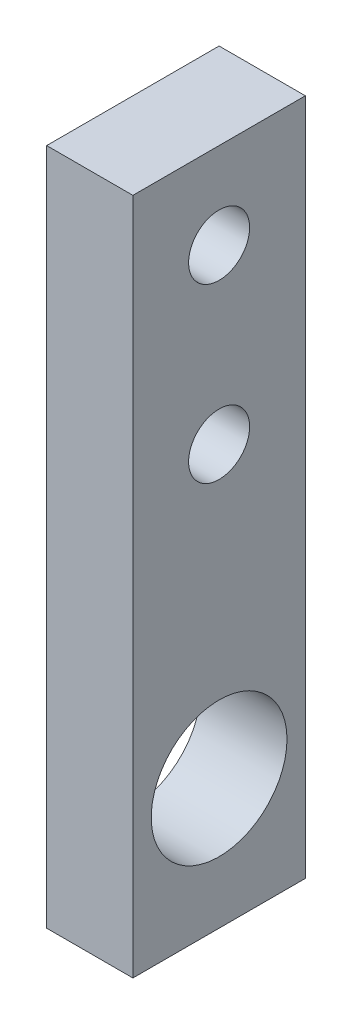
ISO-10303-21;
HEADER;
FILE_DESCRIPTION(('STEP AP214'),'2;1');
FILE_NAME('part.step','',(''),(''),'','','');
FILE_SCHEMA(('AUTOMOTIVE_DESIGN { 1 0 10303 214 1 1 1 1 }'));
ENDSEC;
DATA;
#1=APPLICATION_CONTEXT('core data for automotive mechanical design processes');
#2=APPLICATION_PROTOCOL_DEFINITION('international standard','automotive_design',2000,#1);
#3=PRODUCT_CONTEXT('',#1,'mechanical');
#4=PRODUCT('Part','Part','',(#3));
#5=PRODUCT_RELATED_PRODUCT_CATEGORY('part','',(#4));
#6=PRODUCT_DEFINITION_FORMATION('','',#4);
#7=PRODUCT_DEFINITION_CONTEXT('part definition',#1,'design');
#8=PRODUCT_DEFINITION('design','',#6,#7);
#9=PRODUCT_DEFINITION_SHAPE('','',#8);
#10=(LENGTH_UNIT() NAMED_UNIT(*) SI_UNIT(.MILLI.,.METRE.));
#11=(NAMED_UNIT(*) PLANE_ANGLE_UNIT() SI_UNIT($,.RADIAN.));
#12=(NAMED_UNIT(*) SI_UNIT($,.STERADIAN.) SOLID_ANGLE_UNIT());
#13=UNCERTAINTY_MEASURE_WITH_UNIT(LENGTH_MEASURE(1.E-05),#10,'distance_accuracy_value','');
#14=(GEOMETRIC_REPRESENTATION_CONTEXT(3) GLOBAL_UNCERTAINTY_ASSIGNED_CONTEXT((#13)) GLOBAL_UNIT_ASSIGNED_CONTEXT((#10,
#11,#12)) REPRESENTATION_CONTEXT('',''));
#15=CARTESIAN_POINT('',(0.,0.,0.));
#16=DIRECTION('',(0.,0.,1.));
#17=DIRECTION('',(1.,0.,0.));
#18=AXIS2_PLACEMENT_3D('',#15,#16,#17);
#19=CARTESIAN_POINT('',(40.64,-24.530132824,10.475));
#20=DIRECTION('',(-1.,0.,0.));
#21=DIRECTION('',(0.,0.,1.));
#22=AXIS2_PLACEMENT_3D('',#19,#20,#21);
#23=PLANE('',#22);
#24=CARTESIAN_POINT('',(40.64,6.35,16.825));
#25=DIRECTION('',(-1.,0.,0.));
#26=DIRECTION('',(0.,0.,1.));
#27=AXIS2_PLACEMENT_3D('',#24,#25,#26);
#28=CIRCLE('',#27,2.2479);
#29=CARTESIAN_POINT('',(40.64,6.35,19.0729));
#30=VERTEX_POINT('',#29);
#31=EDGE_CURVE('E222',#30,#30,#28,.T.);
#32=ORIENTED_EDGE('',*,*,#31,.F.);
#33=EDGE_LOOP('',(#32));
#34=FACE_BOUND('',#33,.T.);
#35=CARTESIAN_POINT('',(40.64,19.05,16.825));
#36=DIRECTION('',(-1.,0.,0.));
#37=DIRECTION('',(0.,0.,1.));
#38=AXIS2_PLACEMENT_3D('',#35,#36,#37);
#39=CIRCLE('',#38,2.2479);
#40=CARTESIAN_POINT('',(40.64,19.05,19.0729));
#41=VERTEX_POINT('',#40);
#42=EDGE_CURVE('E113',#41,#41,#39,.T.);
#43=ORIENTED_EDGE('',*,*,#42,.F.);
#44=EDGE_LOOP('',(#43));
#45=FACE_BOUND('',#44,.T.);
#46=DIRECTION('',(0.,-1.,0.));
#47=VECTOR('',#46,1.);
#48=CARTESIAN_POINT('',(40.64,-24.520132824,23.175));
#49=LINE('',#48,#47);
#50=CARTESIAN_POINT('',(40.64,25.4,23.175));
#51=VERTEX_POINT('',#50);
#52=CARTESIAN_POINT('',(40.64,-24.520132824,23.175));
#53=VERTEX_POINT('',#52);
#54=EDGE_CURVE('E101',#51,#53,#49,.T.);
#55=ORIENTED_EDGE('',*,*,#54,.F.);
#56=DIRECTION('',(0.,0.,-1.));
#57=VECTOR('',#56,1.);
#58=CARTESIAN_POINT('',(40.64,25.4,0.));
#59=LINE('',#58,#57);
#60=CARTESIAN_POINT('',(40.64,25.4,10.475));
#61=VERTEX_POINT('',#60);
#62=EDGE_CURVE('E129',#51,#61,#59,.T.);
#63=ORIENTED_EDGE('',*,*,#62,.T.);
#64=DIRECTION('',(0.,1.,0.));
#65=VECTOR('',#64,1.);
#66=CARTESIAN_POINT('',(40.64,25.4,10.475));
#67=LINE('',#66,#65);
#68=CARTESIAN_POINT('',(40.64,-24.520132824,10.475));
#69=VERTEX_POINT('',#68);
#70=EDGE_CURVE('E61',#69,#61,#67,.T.);
#71=ORIENTED_EDGE('',*,*,#70,.F.);
#72=DIRECTION('',(0.,0.,-1.));
#73=VECTOR('',#72,1.);
#74=CARTESIAN_POINT('',(40.64,-24.520132824,10.475));
#75=LINE('',#74,#73);
#76=EDGE_CURVE('E104',#53,#69,#75,.T.);
#77=ORIENTED_EDGE('',*,*,#76,.F.);
#78=EDGE_LOOP('',(#55,#63,#71,#77));
#79=FACE_BOUND('',#78,.T.);
#80=CARTESIAN_POINT('',(40.64,-14.96,16.825));
#81=DIRECTION('',(1.,0.,0.));
#82=DIRECTION('',(0.,0.,-1.));
#83=AXIS2_PLACEMENT_3D('',#80,#81,#82);
#84=CIRCLE('',#83,4.99999);
#85=CARTESIAN_POINT('',(40.64,-14.96,11.82501));
#86=VERTEX_POINT('',#85);
#87=EDGE_CURVE('E11',#86,#86,#84,.T.);
#88=ORIENTED_EDGE('',*,*,#87,.T.);
#89=EDGE_LOOP('',(#88));
#90=FACE_BOUND('',#89,.T.);
#91=ADVANCED_FACE('F41',(#34,#45,#79,#90),#23,.T.);
#92=CARTESIAN_POINT('',(0.,25.4,0.));
#93=DIRECTION('',(0.,-1.,0.));
#94=DIRECTION('',(0.,0.,-1.));
#95=AXIS2_PLACEMENT_3D('',#92,#93,#94);
#96=PLANE('',#95);
#97=ORIENTED_EDGE('',*,*,#62,.F.);
#98=DIRECTION('',(-1.,0.,0.));
#99=VECTOR('',#98,1.);
#100=CARTESIAN_POINT('',(40.64,25.4,23.175));
#101=LINE('',#100,#99);
#102=CARTESIAN_POINT('',(46.99,25.4,23.175));
#103=VERTEX_POINT('',#102);
#104=EDGE_CURVE('E111',#103,#51,#101,.T.);
#105=ORIENTED_EDGE('',*,*,#104,.F.);
#106=DIRECTION('',(0.,0.,1.));
#107=VECTOR('',#106,1.);
#108=CARTESIAN_POINT('',(46.99,25.4,23.175));
#109=LINE('',#108,#107);
#110=CARTESIAN_POINT('',(46.99,25.4,10.475));
#111=VERTEX_POINT('',#110);
#112=EDGE_CURVE('E90',#111,#103,#109,.T.);
#113=ORIENTED_EDGE('',*,*,#112,.F.);
#114=DIRECTION('',(-1.,0.,0.));
#115=VECTOR('',#114,1.);
#116=CARTESIAN_POINT('',(40.64,25.4,10.475));
#117=LINE('',#116,#115);
#118=EDGE_CURVE('E45',#111,#61,#117,.T.);
#119=ORIENTED_EDGE('',*,*,#118,.T.);
#120=EDGE_LOOP('',(#97,#105,#113,#119));
#121=FACE_BOUND('',#120,.T.);
#122=ADVANCED_FACE('F139',(#121),#96,.F.);
#123=CARTESIAN_POINT('',(40.64,25.4,23.175));
#124=DIRECTION('',(0.,0.,1.));
#125=DIRECTION('',(1.,0.,0.));
#126=AXIS2_PLACEMENT_3D('',#123,#124,#125);
#127=PLANE('',#126);
#128=ORIENTED_EDGE('',*,*,#104,.T.);
#129=ORIENTED_EDGE('',*,*,#54,.T.);
#130=DIRECTION('',(-1.,0.,0.));
#131=VECTOR('',#130,1.);
#132=CARTESIAN_POINT('',(46.99,-24.520132824,23.175));
#133=LINE('',#132,#131);
#134=CARTESIAN_POINT('',(46.99,-24.520132824,23.175));
#135=VERTEX_POINT('',#134);
#136=EDGE_CURVE('E106',#135,#53,#133,.T.);
#137=ORIENTED_EDGE('',*,*,#136,.F.);
#138=DIRECTION('',(0.,-1.,0.));
#139=VECTOR('',#138,1.);
#140=CARTESIAN_POINT('',(46.99,-24.520132824,23.175));
#141=LINE('',#140,#139);
#142=EDGE_CURVE('E96',#103,#135,#141,.T.);
#143=ORIENTED_EDGE('',*,*,#142,.F.);
#144=EDGE_LOOP('',(#128,#129,#137,#143));
#145=FACE_BOUND('',#144,.T.);
#146=ADVANCED_FACE('F43',(#145),#127,.T.);
#147=CARTESIAN_POINT('',(46.99,0.,0.));
#148=DIRECTION('',(-1.,0.,0.));
#149=DIRECTION('',(0.,0.,1.));
#150=AXIS2_PLACEMENT_3D('',#147,#148,#149);
#151=PLANE('',#150);
#152=CARTESIAN_POINT('',(46.99,6.35,16.825));
#153=DIRECTION('',(-1.,0.,0.));
#154=DIRECTION('',(0.,0.,1.));
#155=AXIS2_PLACEMENT_3D('',#152,#153,#154);
#156=CIRCLE('',#155,2.2479);
#157=CARTESIAN_POINT('',(46.99,6.35,19.0729));
#158=VERTEX_POINT('',#157);
#159=EDGE_CURVE('E219',#158,#158,#156,.T.);
#160=ORIENTED_EDGE('',*,*,#159,.T.);
#161=EDGE_LOOP('',(#160));
#162=FACE_BOUND('',#161,.T.);
#163=CARTESIAN_POINT('',(46.99,19.05,16.825));
#164=DIRECTION('',(-1.,0.,0.));
#165=DIRECTION('',(0.,0.,1.));
#166=AXIS2_PLACEMENT_3D('',#163,#164,#165);
#167=CIRCLE('',#166,2.2479);
#168=CARTESIAN_POINT('',(46.99,19.05,19.0729));
#169=VERTEX_POINT('',#168);
#170=EDGE_CURVE('E224',#169,#169,#167,.T.);
#171=ORIENTED_EDGE('',*,*,#170,.T.);
#172=EDGE_LOOP('',(#171));
#173=FACE_BOUND('',#172,.T.);
#174=DIRECTION('',(0.,0.,-1.));
#175=VECTOR('',#174,1.);
#176=CARTESIAN_POINT('',(46.99,-24.520132824,10.475));
#177=LINE('',#176,#175);
#178=CARTESIAN_POINT('',(46.99,-24.520132824,10.475));
#179=VERTEX_POINT('',#178);
#180=EDGE_CURVE('E89',#135,#179,#177,.T.);
#181=ORIENTED_EDGE('',*,*,#180,.T.);
#182=DIRECTION('',(0.,1.,0.));
#183=VECTOR('',#182,1.);
#184=CARTESIAN_POINT('',(46.99,25.4,10.475));
#185=LINE('',#184,#183);
#186=EDGE_CURVE('E79',#179,#111,#185,.T.);
#187=ORIENTED_EDGE('',*,*,#186,.T.);
#188=ORIENTED_EDGE('',*,*,#112,.T.);
#189=ORIENTED_EDGE('',*,*,#142,.T.);
#190=EDGE_LOOP('',(#181,#187,#188,#189));
#191=FACE_BOUND('',#190,.T.);
#192=CARTESIAN_POINT('',(46.99,-14.96,16.825));
#193=DIRECTION('',(1.,0.,0.));
#194=DIRECTION('',(0.,0.,-1.));
#195=AXIS2_PLACEMENT_3D('',#192,#193,#194);
#196=CIRCLE('',#195,4.99999);
#197=CARTESIAN_POINT('',(46.99,-14.96,11.82501));
#198=VERTEX_POINT('',#197);
#199=EDGE_CURVE('E52',#198,#198,#196,.T.);
#200=ORIENTED_EDGE('',*,*,#199,.F.);
#201=EDGE_LOOP('',(#200));
#202=FACE_BOUND('',#201,.T.);
#203=ADVANCED_FACE('F93',(#162,#173,#191,#202),#151,.F.);
#204=CARTESIAN_POINT('',(46.99,-14.96,16.825));
#205=DIRECTION('',(-1.,0.,0.));
#206=DIRECTION('',(0.,0.,1.));
#207=AXIS2_PLACEMENT_3D('',#204,#205,#206);
#208=CYLINDRICAL_SURFACE('',#207,4.99999);
#209=ORIENTED_EDGE('',*,*,#199,.T.);
#210=EDGE_LOOP('',(#209));
#211=FACE_BOUND('',#210,.T.);
#212=ORIENTED_EDGE('',*,*,#87,.F.);
#213=EDGE_LOOP('',(#212));
#214=FACE_BOUND('',#213,.T.);
#215=ADVANCED_FACE('F147',(#211,#214),#208,.F.);
#216=CARTESIAN_POINT('',(40.64,25.4,10.475));
#217=DIRECTION('',(0.,0.,-1.));
#218=DIRECTION('',(0.,1.,0.));
#219=AXIS2_PLACEMENT_3D('',#216,#217,#218);
#220=PLANE('',#219);
#221=ORIENTED_EDGE('',*,*,#70,.T.);
#222=ORIENTED_EDGE('',*,*,#118,.F.);
#223=ORIENTED_EDGE('',*,*,#186,.F.);
#224=DIRECTION('',(-1.,0.,0.));
#225=VECTOR('',#224,1.);
#226=CARTESIAN_POINT('',(46.99,-24.520132824,10.475));
#227=LINE('',#226,#225);
#228=EDGE_CURVE('E83',#179,#69,#227,.T.);
#229=ORIENTED_EDGE('',*,*,#228,.T.);
#230=EDGE_LOOP('',(#221,#222,#223,#229));
#231=FACE_BOUND('',#230,.T.);
#232=ADVANCED_FACE('F81',(#231),#220,.T.);
#233=CARTESIAN_POINT('',(46.99,-24.520132824,10.475));
#234=DIRECTION('',(0.,1.,0.));
#235=DIRECTION('',(0.,0.,1.));
#236=AXIS2_PLACEMENT_3D('',#233,#234,#235);
#237=PLANE('',#236);
#238=ORIENTED_EDGE('',*,*,#76,.T.);
#239=ORIENTED_EDGE('',*,*,#228,.F.);
#240=ORIENTED_EDGE('',*,*,#180,.F.);
#241=ORIENTED_EDGE('',*,*,#136,.T.);
#242=EDGE_LOOP('',(#238,#239,#240,#241));
#243=FACE_BOUND('',#242,.T.);
#244=ADVANCED_FACE('F103',(#243),#237,.F.);
#245=CARTESIAN_POINT('',(-40.64,19.05,16.825));
#246=DIRECTION('',(1.,0.,0.));
#247=DIRECTION('',(0.,0.,1.));
#248=AXIS2_PLACEMENT_3D('',#245,#246,#247);
#249=CYLINDRICAL_SURFACE('',#248,2.2479);
#250=ORIENTED_EDGE('',*,*,#170,.F.);
#251=EDGE_LOOP('',(#250));
#252=FACE_BOUND('',#251,.T.);
#253=ORIENTED_EDGE('',*,*,#42,.T.);
#254=EDGE_LOOP('',(#253));
#255=FACE_BOUND('',#254,.T.);
#256=ADVANCED_FACE('F144',(#252,#255),#249,.F.);
#257=CARTESIAN_POINT('',(-40.64,6.35,16.825));
#258=DIRECTION('',(1.,0.,0.));
#259=DIRECTION('',(0.,0.,1.));
#260=AXIS2_PLACEMENT_3D('',#257,#258,#259);
#261=CYLINDRICAL_SURFACE('',#260,2.2479);
#262=ORIENTED_EDGE('',*,*,#159,.F.);
#263=EDGE_LOOP('',(#262));
#264=FACE_BOUND('',#263,.T.);
#265=ORIENTED_EDGE('',*,*,#31,.T.);
#266=EDGE_LOOP('',(#265));
#267=FACE_BOUND('',#266,.T.);
#268=ADVANCED_FACE('F203',(#264,#267),#261,.F.);
#269=CLOSED_SHELL('',(#91,#122,#146,#203,#215,#232,#244,#256,#268));
#270=MANIFOLD_SOLID_BREP('B2',#269);
#271=ADVANCED_BREP_SHAPE_REPRESENTATION('',(#18,#270),#14);
#272=SHAPE_DEFINITION_REPRESENTATION(#9,#271);
ENDSEC;
END-ISO-10303-21;
